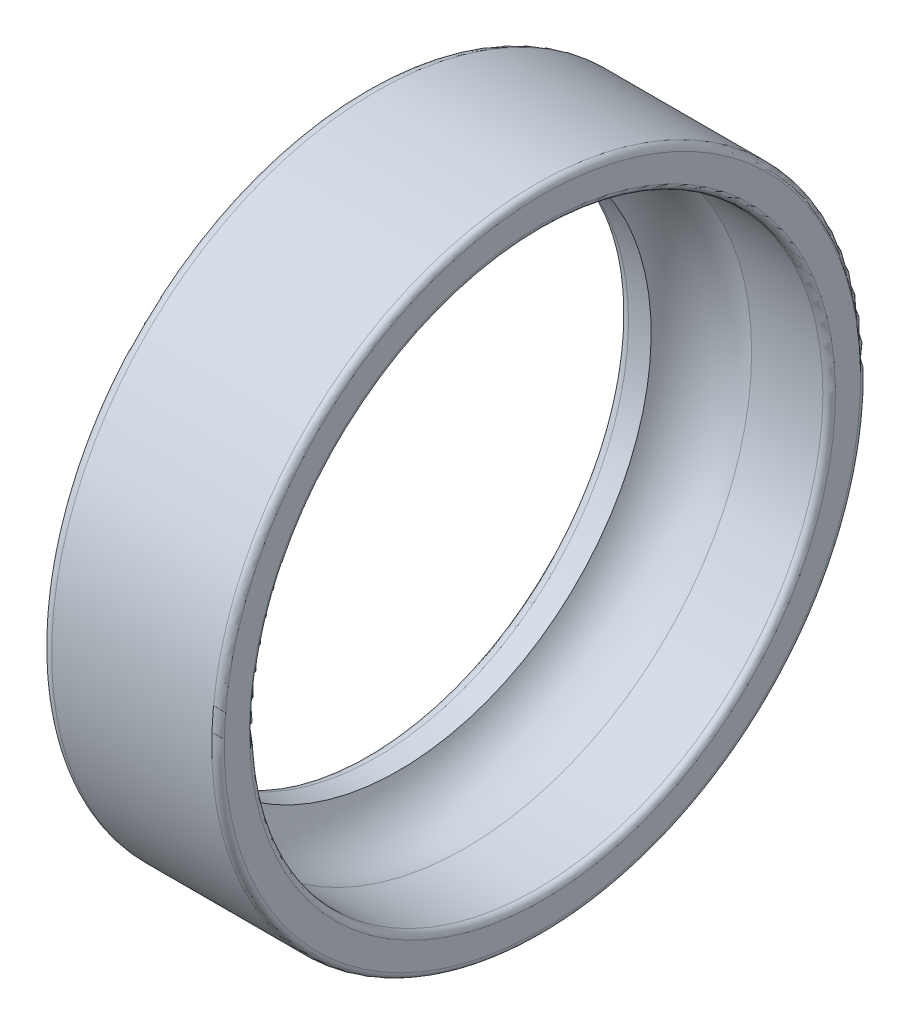
ISO-10303-21;
HEADER;
FILE_DESCRIPTION(('STEP AP214'),'2;1');
FILE_NAME('part.step','',(''),(''),'','','');
FILE_SCHEMA(('AUTOMOTIVE_DESIGN { 1 0 10303 214 1 1 1 1 }'));
ENDSEC;
DATA;
#1=APPLICATION_CONTEXT('core data for automotive mechanical design processes');
#2=APPLICATION_PROTOCOL_DEFINITION('international standard','automotive_design',2000,#1);
#3=PRODUCT_CONTEXT('',#1,'mechanical');
#4=PRODUCT('Part','Part','',(#3));
#5=PRODUCT_RELATED_PRODUCT_CATEGORY('part','',(#4));
#6=PRODUCT_DEFINITION_FORMATION('','',#4);
#7=PRODUCT_DEFINITION_CONTEXT('part definition',#1,'design');
#8=PRODUCT_DEFINITION('design','',#6,#7);
#9=PRODUCT_DEFINITION_SHAPE('','',#8);
#10=(LENGTH_UNIT() NAMED_UNIT(*) SI_UNIT(.MILLI.,.METRE.));
#11=(NAMED_UNIT(*) PLANE_ANGLE_UNIT() SI_UNIT($,.RADIAN.));
#12=(NAMED_UNIT(*) SI_UNIT($,.STERADIAN.) SOLID_ANGLE_UNIT());
#13=UNCERTAINTY_MEASURE_WITH_UNIT(LENGTH_MEASURE(1.E-05),#10,'distance_accuracy_value','');
#14=(GEOMETRIC_REPRESENTATION_CONTEXT(3) GLOBAL_UNCERTAINTY_ASSIGNED_CONTEXT((#13)) GLOBAL_UNIT_ASSIGNED_CONTEXT((#10,
#11,#12)) REPRESENTATION_CONTEXT('',''));
#15=CARTESIAN_POINT('',(0.,0.,0.));
#16=DIRECTION('',(0.,0.,1.));
#17=DIRECTION('',(1.,0.,0.));
#18=AXIS2_PLACEMENT_3D('',#15,#16,#17);
#19=CARTESIAN_POINT('',(2.18170499179333,0.,0.));
#20=DIRECTION('',(-1.,0.,0.));
#21=DIRECTION('',(0.,1.,0.));
#22=AXIS2_PLACEMENT_3D('',#19,#20,#21);
#23=CYLINDRICAL_SURFACE('',#22,24.125);
#24=CARTESIAN_POINT('',(3.26340998358664,0.,0.));
#25=DIRECTION('',(1.,0.,0.));
#26=DIRECTION('',(0.,1.,0.));
#27=AXIS2_PLACEMENT_3D('',#24,#25,#26);
#28=CIRCLE('',#27,24.125);
#29=CARTESIAN_POINT('',(3.26340998358664,24.125,0.));
#30=VERTEX_POINT('',#29);
#31=EDGE_CURVE('E10',#30,#30,#28,.T.);
#32=ORIENTED_EDGE('',*,*,#31,.T.);
#33=EDGE_LOOP('',(#32));
#34=FACE_BOUND('',#33,.T.);
#35=CARTESIAN_POINT('',(1.1,0.,0.));
#36=DIRECTION('',(1.,0.,0.));
#37=DIRECTION('',(0.,1.,0.));
#38=AXIS2_PLACEMENT_3D('',#35,#36,#37);
#39=CIRCLE('',#38,24.125);
#40=CARTESIAN_POINT('',(1.1,24.125,0.));
#41=VERTEX_POINT('',#40);
#42=EDGE_CURVE('E19',#41,#41,#39,.T.);
#43=ORIENTED_EDGE('',*,*,#42,.F.);
#44=EDGE_LOOP('',(#43));
#45=FACE_BOUND('',#44,.T.);
#46=ADVANCED_FACE('F15',(#34,#45),#23,.F.);
#47=CARTESIAN_POINT('',(8.5,0.,0.));
#48=DIRECTION('',(1.,0.,0.));
#49=DIRECTION('',(0.,0.,-1.));
#50=AXIS2_PLACEMENT_3D('',#47,#48,#49);
#51=TOROIDAL_SURFACE('',#50,21.75,5.75);
#52=CARTESIAN_POINT('',(9.59383499669738,0.,0.));
#53=DIRECTION('',(1.,0.,0.));
#54=DIRECTION('',(0.,1.,0.));
#55=AXIS2_PLACEMENT_3D('',#52,#53,#54);
#56=CIRCLE('',#55,27.395);
#57=CARTESIAN_POINT('',(9.59383499669738,27.395,0.));
#58=VERTEX_POINT('',#57);
#59=EDGE_CURVE('E25',#58,#58,#56,.T.);
#60=ORIENTED_EDGE('',*,*,#59,.T.);
#61=EDGE_LOOP('',(#60));
#62=FACE_BOUND('',#61,.T.);
#63=ORIENTED_EDGE('',*,*,#31,.F.);
#64=EDGE_LOOP('',(#63));
#65=FACE_BOUND('',#64,.T.);
#66=ADVANCED_FACE('F102',(#62,#65),#51,.F.);
#67=CARTESIAN_POINT('',(12.9969174983487,0.,0.));
#68=DIRECTION('',(-1.,0.,0.));
#69=DIRECTION('',(0.,1.,0.));
#70=AXIS2_PLACEMENT_3D('',#67,#68,#69);
#71=CYLINDRICAL_SURFACE('',#70,27.395);
#72=CARTESIAN_POINT('',(16.4,0.,0.));
#73=DIRECTION('',(1.,0.,0.));
#74=DIRECTION('',(0.,1.,0.));
#75=AXIS2_PLACEMENT_3D('',#72,#73,#74);
#76=CIRCLE('',#75,27.395);
#77=CARTESIAN_POINT('',(16.4,27.395,0.));
#78=VERTEX_POINT('',#77);
#79=EDGE_CURVE('E61',#78,#78,#76,.T.);
#80=ORIENTED_EDGE('',*,*,#79,.T.);
#81=EDGE_LOOP('',(#80));
#82=FACE_BOUND('',#81,.T.);
#83=ORIENTED_EDGE('',*,*,#59,.F.);
#84=EDGE_LOOP('',(#83));
#85=FACE_BOUND('',#84,.T.);
#86=ADVANCED_FACE('F62',(#82,#85),#71,.F.);
#87=CARTESIAN_POINT('',(16.4,0.,0.));
#88=DIRECTION('',(1.,0.,0.));
#89=DIRECTION('',(0.,0.,-1.));
#90=AXIS2_PLACEMENT_3D('',#87,#88,#89);
#91=TOROIDAL_SURFACE('',#90,27.995,0.6);
#92=CARTESIAN_POINT('',(17.,0.,0.));
#93=DIRECTION('',(1.,0.,0.));
#94=DIRECTION('',(0.,1.,0.));
#95=AXIS2_PLACEMENT_3D('',#92,#93,#94);
#96=CIRCLE('',#95,27.995);
#97=CARTESIAN_POINT('',(17.,27.995,0.));
#98=VERTEX_POINT('',#97);
#99=EDGE_CURVE('E57',#98,#98,#96,.T.);
#100=ORIENTED_EDGE('',*,*,#99,.T.);
#101=EDGE_LOOP('',(#100));
#102=FACE_BOUND('',#101,.T.);
#103=ORIENTED_EDGE('',*,*,#79,.F.);
#104=EDGE_LOOP('',(#103));
#105=FACE_BOUND('',#104,.T.);
#106=ADVANCED_FACE('F121',(#102,#105),#91,.T.);
#107=CARTESIAN_POINT('',(17.,29.1975,0.));
#108=DIRECTION('',(1.,0.,0.));
#109=DIRECTION('',(0.,1.,0.));
#110=AXIS2_PLACEMENT_3D('',#107,#108,#109);
#111=PLANE('',#110);
#112=CARTESIAN_POINT('',(17.,0.,0.));
#113=DIRECTION('',(1.,0.,0.));
#114=DIRECTION('',(0.,1.,0.));
#115=AXIS2_PLACEMENT_3D('',#112,#113,#114);
#116=CIRCLE('',#115,30.4);
#117=CARTESIAN_POINT('',(17.,30.4,0.));
#118=VERTEX_POINT('',#117);
#119=EDGE_CURVE('E53',#118,#118,#116,.T.);
#120=ORIENTED_EDGE('',*,*,#119,.T.);
#121=EDGE_LOOP('',(#120));
#122=FACE_BOUND('',#121,.T.);
#123=ORIENTED_EDGE('',*,*,#99,.F.);
#124=EDGE_LOOP('',(#123));
#125=FACE_BOUND('',#124,.T.);
#126=ADVANCED_FACE('F115',(#122,#125),#111,.T.);
#127=CARTESIAN_POINT('',(16.4,0.,0.));
#128=DIRECTION('',(1.,0.,0.));
#129=DIRECTION('',(0.,0.,-1.));
#130=AXIS2_PLACEMENT_3D('',#127,#128,#129);
#131=TOROIDAL_SURFACE('',#130,30.4,0.6);
#132=CARTESIAN_POINT('',(16.4,0.,0.));
#133=DIRECTION('',(1.,0.,0.));
#134=DIRECTION('',(0.,1.,0.));
#135=AXIS2_PLACEMENT_3D('',#132,#133,#134);
#136=CIRCLE('',#135,31.);
#137=CARTESIAN_POINT('',(16.4,31.,0.));
#138=VERTEX_POINT('',#137);
#139=EDGE_CURVE('E72',#138,#138,#136,.T.);
#140=ORIENTED_EDGE('',*,*,#139,.T.);
#141=EDGE_LOOP('',(#140));
#142=FACE_BOUND('',#141,.T.);
#143=ORIENTED_EDGE('',*,*,#119,.F.);
#144=EDGE_LOOP('',(#143));
#145=FACE_BOUND('',#144,.T.);
#146=ADVANCED_FACE('F17',(#142,#145),#131,.T.);
#147=CARTESIAN_POINT('',(8.75,0.,0.));
#148=DIRECTION('',(-1.,0.,0.));
#149=DIRECTION('',(0.,1.,0.));
#150=AXIS2_PLACEMENT_3D('',#147,#148,#149);
#151=CYLINDRICAL_SURFACE('',#150,31.);
#152=CARTESIAN_POINT('',(1.1,0.,0.));
#153=DIRECTION('',(1.,0.,0.));
#154=DIRECTION('',(0.,1.,0.));
#155=AXIS2_PLACEMENT_3D('',#152,#153,#154);
#156=CIRCLE('',#155,31.);
#157=CARTESIAN_POINT('',(1.1,31.,0.));
#158=VERTEX_POINT('',#157);
#159=EDGE_CURVE('E73',#158,#158,#156,.T.);
#160=ORIENTED_EDGE('',*,*,#159,.T.);
#161=EDGE_LOOP('',(#160));
#162=FACE_BOUND('',#161,.T.);
#163=ORIENTED_EDGE('',*,*,#139,.F.);
#164=EDGE_LOOP('',(#163));
#165=FACE_BOUND('',#164,.T.);
#166=ADVANCED_FACE('F98',(#162,#165),#151,.T.);
#167=CARTESIAN_POINT('',(1.1,0.,0.));
#168=DIRECTION('',(1.,0.,0.));
#169=DIRECTION('',(0.,0.,-1.));
#170=AXIS2_PLACEMENT_3D('',#167,#168,#169);
#171=TOROIDAL_SURFACE('',#170,29.9,1.1);
#172=CARTESIAN_POINT('',(0.,0.,0.));
#173=DIRECTION('',(1.,0.,0.));
#174=DIRECTION('',(0.,1.,0.));
#175=AXIS2_PLACEMENT_3D('',#172,#173,#174);
#176=CIRCLE('',#175,29.9);
#177=CARTESIAN_POINT('',(0.,29.9,0.));
#178=VERTEX_POINT('',#177);
#179=EDGE_CURVE('E70',#178,#178,#176,.T.);
#180=ORIENTED_EDGE('',*,*,#179,.T.);
#181=EDGE_LOOP('',(#180));
#182=FACE_BOUND('',#181,.T.);
#183=ORIENTED_EDGE('',*,*,#159,.F.);
#184=EDGE_LOOP('',(#183));
#185=FACE_BOUND('',#184,.T.);
#186=ADVANCED_FACE('F85',(#182,#185),#171,.T.);
#187=CARTESIAN_POINT('',(0.,27.5625,0.));
#188=DIRECTION('',(-1.,0.,0.));
#189=DIRECTION('',(0.,-1.,0.));
#190=AXIS2_PLACEMENT_3D('',#187,#188,#189);
#191=PLANE('',#190);
#192=CARTESIAN_POINT('',(0.,0.,0.));
#193=DIRECTION('',(1.,0.,0.));
#194=DIRECTION('',(0.,1.,0.));
#195=AXIS2_PLACEMENT_3D('',#192,#193,#194);
#196=CIRCLE('',#195,25.225);
#197=CARTESIAN_POINT('',(0.,25.225,0.));
#198=VERTEX_POINT('',#197);
#199=EDGE_CURVE('E78',#198,#198,#196,.T.);
#200=ORIENTED_EDGE('',*,*,#199,.T.);
#201=EDGE_LOOP('',(#200));
#202=FACE_BOUND('',#201,.T.);
#203=ORIENTED_EDGE('',*,*,#179,.F.);
#204=EDGE_LOOP('',(#203));
#205=FACE_BOUND('',#204,.T.);
#206=ADVANCED_FACE('F88',(#202,#205),#191,.T.);
#207=CARTESIAN_POINT('',(1.1,0.,0.));
#208=DIRECTION('',(1.,0.,0.));
#209=DIRECTION('',(0.,0.,-1.));
#210=AXIS2_PLACEMENT_3D('',#207,#208,#209);
#211=TOROIDAL_SURFACE('',#210,25.225,1.1);
#212=ORIENTED_EDGE('',*,*,#42,.T.);
#213=EDGE_LOOP('',(#212));
#214=FACE_BOUND('',#213,.T.);
#215=ORIENTED_EDGE('',*,*,#199,.F.);
#216=EDGE_LOOP('',(#215));
#217=FACE_BOUND('',#216,.T.);
#218=ADVANCED_FACE('F90',(#214,#217),#211,.T.);
#219=CLOSED_SHELL('',(#46,#66,#86,#106,#126,#146,#166,#186,#206,#218));
#220=MANIFOLD_SOLID_BREP('B1',#219);
#221=ADVANCED_BREP_SHAPE_REPRESENTATION('',(#18,#220),#14);
#222=SHAPE_DEFINITION_REPRESENTATION(#9,#221);
ENDSEC;
END-ISO-10303-21;
